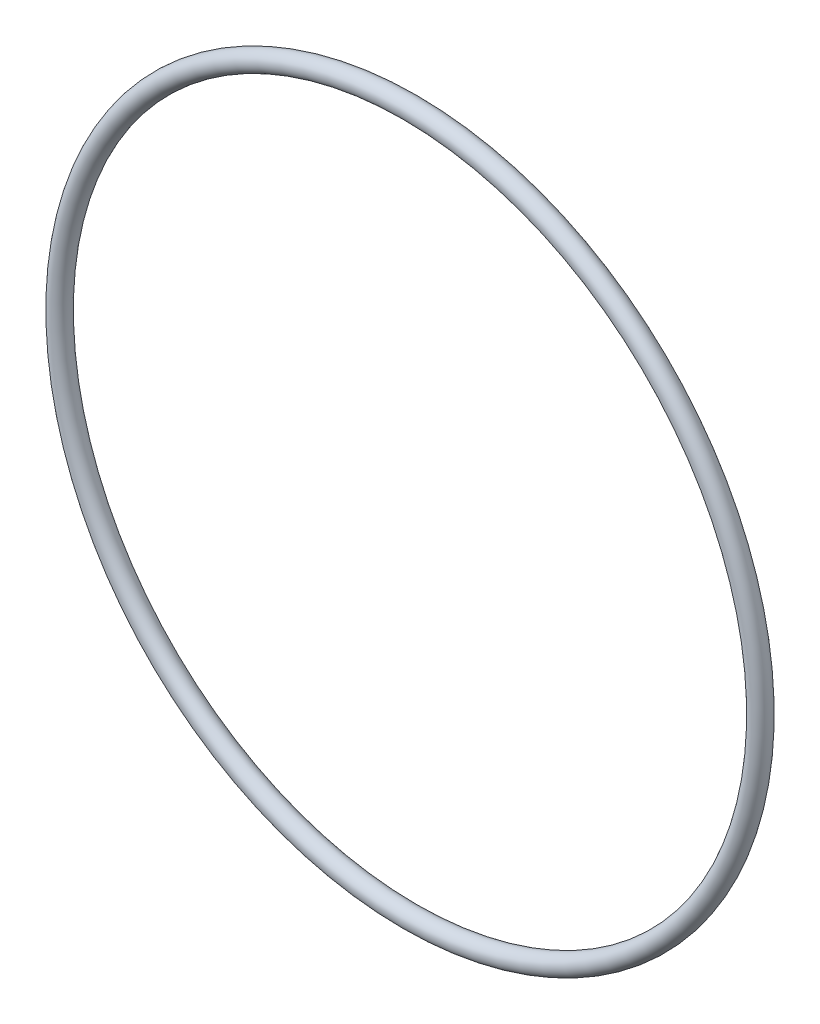
ISO-10303-21;
HEADER;
FILE_DESCRIPTION(('STEP AP214'),'2;1');
FILE_NAME('part.step','',(''),(''),'','','');
FILE_SCHEMA(('AUTOMOTIVE_DESIGN { 1 0 10303 214 1 1 1 1 }'));
ENDSEC;
DATA;
#1=APPLICATION_CONTEXT('core data for automotive mechanical design processes');
#2=APPLICATION_PROTOCOL_DEFINITION('international standard','automotive_design',2000,#1);
#3=PRODUCT_CONTEXT('',#1,'mechanical');
#4=PRODUCT('Part','Part','',(#3));
#5=PRODUCT_RELATED_PRODUCT_CATEGORY('part','',(#4));
#6=PRODUCT_DEFINITION_FORMATION('','',#4);
#7=PRODUCT_DEFINITION_CONTEXT('part definition',#1,'design');
#8=PRODUCT_DEFINITION('design','',#6,#7);
#9=PRODUCT_DEFINITION_SHAPE('','',#8);
#10=(LENGTH_UNIT() NAMED_UNIT(*) SI_UNIT(.MILLI.,.METRE.));
#11=(NAMED_UNIT(*) PLANE_ANGLE_UNIT() SI_UNIT($,.RADIAN.));
#12=(NAMED_UNIT(*) SI_UNIT($,.STERADIAN.) SOLID_ANGLE_UNIT());
#13=UNCERTAINTY_MEASURE_WITH_UNIT(LENGTH_MEASURE(1.E-05),#10,'distance_accuracy_value','');
#14=(GEOMETRIC_REPRESENTATION_CONTEXT(3) GLOBAL_UNCERTAINTY_ASSIGNED_CONTEXT((#13)) GLOBAL_UNIT_ASSIGNED_CONTEXT((#10,
#11,#12)) REPRESENTATION_CONTEXT('',''));
#15=CARTESIAN_POINT('',(0.,0.,0.));
#16=DIRECTION('',(0.,0.,1.));
#17=DIRECTION('',(1.,0.,0.));
#18=AXIS2_PLACEMENT_3D('',#15,#16,#17);
#19=CARTESIAN_POINT('',(0.,0.,0.));
#20=DIRECTION('',(0.,0.,1.));
#21=DIRECTION('',(0.,-1.,0.));
#22=AXIS2_PLACEMENT_3D('',#19,#20,#21);
#23=TOROIDAL_SURFACE('',#22,63.4746,1.7653);
#24=CARTESIAN_POINT('',(0.,-65.2398999999999,0.));
#25=VERTEX_POINT('',#24);
#26=VERTEX_LOOP('',#25);
#27=FACE_BOUND('',#26,.T.);
#28=ADVANCED_FACE('F35',(#27),#23,.T.);
#29=CLOSED_SHELL('',(#28));
#30=MANIFOLD_SOLID_BREP('B2',#29);
#31=ADVANCED_BREP_SHAPE_REPRESENTATION('',(#18,#30),#14);
#32=SHAPE_DEFINITION_REPRESENTATION(#9,#31);
ENDSEC;
END-ISO-10303-21;
